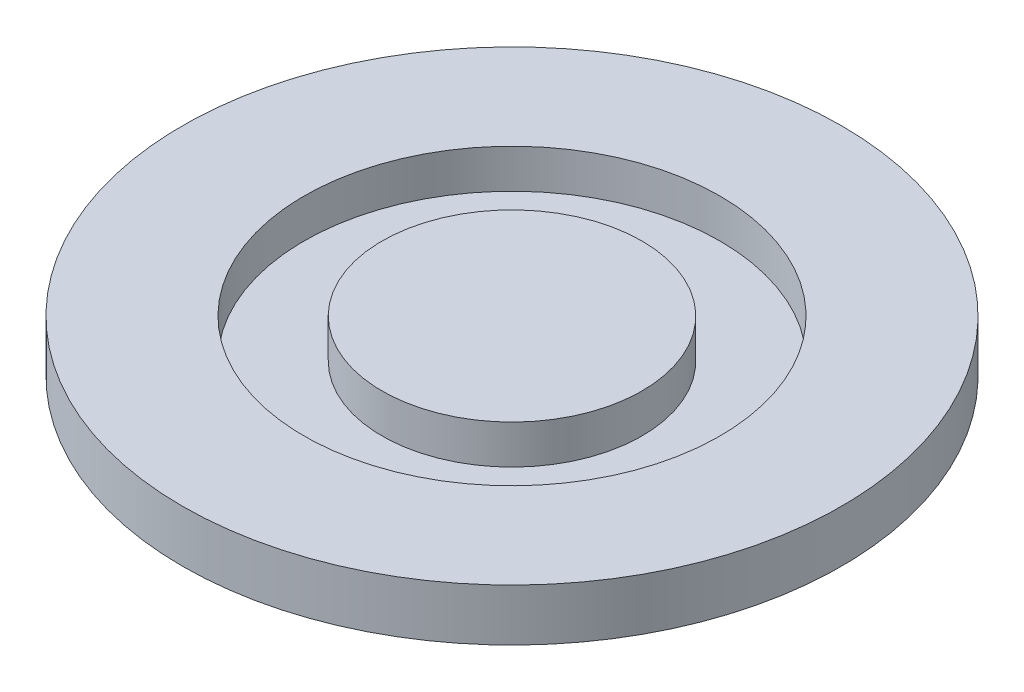
ISO-10303-21;
HEADER;
FILE_DESCRIPTION(('STEP AP214'),'2;1');
FILE_NAME('part.step','',(''),(''),'','','');
FILE_SCHEMA(('AUTOMOTIVE_DESIGN { 1 0 10303 214 1 1 1 1 }'));
ENDSEC;
DATA;
#1=APPLICATION_CONTEXT('core data for automotive mechanical design processes');
#2=APPLICATION_PROTOCOL_DEFINITION('international standard','automotive_design',2000,#1);
#3=PRODUCT_CONTEXT('',#1,'mechanical');
#4=PRODUCT('Part','Part','',(#3));
#5=PRODUCT_RELATED_PRODUCT_CATEGORY('part','',(#4));
#6=PRODUCT_DEFINITION_FORMATION('','',#4);
#7=PRODUCT_DEFINITION_CONTEXT('part definition',#1,'design');
#8=PRODUCT_DEFINITION('design','',#6,#7);
#9=PRODUCT_DEFINITION_SHAPE('','',#8);
#10=(LENGTH_UNIT() NAMED_UNIT(*) SI_UNIT(.MILLI.,.METRE.));
#11=(NAMED_UNIT(*) PLANE_ANGLE_UNIT() SI_UNIT($,.RADIAN.));
#12=(NAMED_UNIT(*) SI_UNIT($,.STERADIAN.) SOLID_ANGLE_UNIT());
#13=UNCERTAINTY_MEASURE_WITH_UNIT(LENGTH_MEASURE(1.E-05),#10,'distance_accuracy_value','');
#14=(GEOMETRIC_REPRESENTATION_CONTEXT(3) GLOBAL_UNCERTAINTY_ASSIGNED_CONTEXT((#13)) GLOBAL_UNIT_ASSIGNED_CONTEXT((#10,
#11,#12)) REPRESENTATION_CONTEXT('',''));
#15=CARTESIAN_POINT('',(0.,0.,0.));
#16=DIRECTION('',(0.,0.,1.));
#17=DIRECTION('',(1.,0.,0.));
#18=AXIS2_PLACEMENT_3D('',#15,#16,#17);
#19=CARTESIAN_POINT('',(80.5120023172982,0.,0.));
#20=DIRECTION('',(0.,-1.,0.));
#21=DIRECTION('',(0.,0.,-1.));
#22=AXIS2_PLACEMENT_3D('',#19,#20,#21);
#23=PLANE('',#22);
#24=CARTESIAN_POINT('',(0.,0.,0.));
#25=DIRECTION('',(0.,-1.,0.));
#26=DIRECTION('',(0.,0.,-1.));
#27=AXIS2_PLACEMENT_3D('',#24,#25,#26);
#28=CIRCLE('',#27,80.5120023172982);
#29=CARTESIAN_POINT('',(0.,0.,-80.5120023172982));
#30=VERTEX_POINT('',#29);
#31=EDGE_CURVE('E52',#30,#30,#28,.T.);
#32=ORIENTED_EDGE('',*,*,#31,.T.);
#33=EDGE_LOOP('',(#32));
#34=FACE_BOUND('',#33,.T.);
#35=ADVANCED_FACE('F30',(#34),#23,.T.);
#36=CARTESIAN_POINT('',(0.,12.7,0.));
#37=DIRECTION('',(0.,1.,0.));
#38=DIRECTION('',(0.,0.,1.));
#39=AXIS2_PLACEMENT_3D('',#36,#37,#38);
#40=PLANE('',#39);
#41=CARTESIAN_POINT('',(0.,12.7,0.));
#42=DIRECTION('',(0.,-1.,0.));
#43=DIRECTION('',(0.,0.,-1.));
#44=AXIS2_PLACEMENT_3D('',#41,#42,#43);
#45=CIRCLE('',#44,31.75);
#46=CARTESIAN_POINT('',(0.,12.7,-31.75));
#47=VERTEX_POINT('',#46);
#48=EDGE_CURVE('E10',#47,#47,#45,.T.);
#49=ORIENTED_EDGE('',*,*,#48,.F.);
#50=EDGE_LOOP('',(#49));
#51=FACE_BOUND('',#50,.T.);
#52=ADVANCED_FACE('F69',(#51),#40,.T.);
#53=CARTESIAN_POINT('',(0.,0.,0.));
#54=DIRECTION('',(0.,-1.,0.));
#55=DIRECTION('',(0.,0.,-1.));
#56=AXIS2_PLACEMENT_3D('',#53,#54,#55);
#57=CYLINDRICAL_SURFACE('',#56,31.75);
#58=ORIENTED_EDGE('',*,*,#48,.T.);
#59=EDGE_LOOP('',(#58));
#60=FACE_BOUND('',#59,.T.);
#61=CARTESIAN_POINT('',(0.,3.17499999999999,0.));
#62=DIRECTION('',(0.,-1.,0.));
#63=DIRECTION('',(0.,0.,-1.));
#64=AXIS2_PLACEMENT_3D('',#61,#62,#63);
#65=CIRCLE('',#64,31.75);
#66=CARTESIAN_POINT('',(0.,3.17499999999999,-31.75));
#67=VERTEX_POINT('',#66);
#68=EDGE_CURVE('E36',#67,#67,#65,.T.);
#69=ORIENTED_EDGE('',*,*,#68,.F.);
#70=EDGE_LOOP('',(#69));
#71=FACE_BOUND('',#70,.T.);
#72=ADVANCED_FACE('F73',(#60,#71),#57,.T.);
#73=CARTESIAN_POINT('',(31.75,3.17499999999999,0.));
#74=DIRECTION('',(0.,1.,0.));
#75=DIRECTION('',(0.,0.,1.));
#76=AXIS2_PLACEMENT_3D('',#73,#74,#75);
#77=PLANE('',#76);
#78=ORIENTED_EDGE('',*,*,#68,.T.);
#79=EDGE_LOOP('',(#78));
#80=FACE_BOUND('',#79,.T.);
#81=CARTESIAN_POINT('',(0.,3.17499999999999,0.));
#82=DIRECTION('',(0.,-1.,0.));
#83=DIRECTION('',(0.,0.,-1.));
#84=AXIS2_PLACEMENT_3D('',#81,#82,#83);
#85=CIRCLE('',#84,50.8);
#86=CARTESIAN_POINT('',(0.,3.17499999999999,-50.8));
#87=VERTEX_POINT('',#86);
#88=EDGE_CURVE('E40',#87,#87,#85,.T.);
#89=ORIENTED_EDGE('',*,*,#88,.F.);
#90=EDGE_LOOP('',(#89));
#91=FACE_BOUND('',#90,.T.);
#92=ADVANCED_FACE('F78',(#80,#91),#77,.T.);
#93=CARTESIAN_POINT('',(0.,0.,0.));
#94=DIRECTION('',(0.,-1.,0.));
#95=DIRECTION('',(0.,0.,-1.));
#96=AXIS2_PLACEMENT_3D('',#93,#94,#95);
#97=CYLINDRICAL_SURFACE('',#96,50.8);
#98=ORIENTED_EDGE('',*,*,#88,.T.);
#99=EDGE_LOOP('',(#98));
#100=FACE_BOUND('',#99,.T.);
#101=CARTESIAN_POINT('',(0.,12.7,0.));
#102=DIRECTION('',(0.,-1.,0.));
#103=DIRECTION('',(0.,0.,-1.));
#104=AXIS2_PLACEMENT_3D('',#101,#102,#103);
#105=CIRCLE('',#104,50.8);
#106=CARTESIAN_POINT('',(0.,12.7,-50.8));
#107=VERTEX_POINT('',#106);
#108=EDGE_CURVE('E44',#107,#107,#105,.T.);
#109=ORIENTED_EDGE('',*,*,#108,.F.);
#110=EDGE_LOOP('',(#109));
#111=FACE_BOUND('',#110,.T.);
#112=ADVANCED_FACE('F65',(#100,#111),#97,.F.);
#113=CARTESIAN_POINT('',(50.8,12.7,0.));
#114=DIRECTION('',(0.,1.,0.));
#115=DIRECTION('',(0.,0.,1.));
#116=AXIS2_PLACEMENT_3D('',#113,#114,#115);
#117=PLANE('',#116);
#118=ORIENTED_EDGE('',*,*,#108,.T.);
#119=EDGE_LOOP('',(#118));
#120=FACE_BOUND('',#119,.T.);
#121=CARTESIAN_POINT('',(0.,12.7,0.));
#122=DIRECTION('',(0.,-1.,0.));
#123=DIRECTION('',(0.,0.,-1.));
#124=AXIS2_PLACEMENT_3D('',#121,#122,#123);
#125=CIRCLE('',#124,80.5120023172982);
#126=CARTESIAN_POINT('',(0.,12.7,-80.5120023172982));
#127=VERTEX_POINT('',#126);
#128=EDGE_CURVE('E49',#127,#127,#125,.T.);
#129=ORIENTED_EDGE('',*,*,#128,.F.);
#130=EDGE_LOOP('',(#129));
#131=FACE_BOUND('',#130,.T.);
#132=ADVANCED_FACE('F59',(#120,#131),#117,.T.);
#133=CARTESIAN_POINT('',(0.,0.,0.));
#134=DIRECTION('',(0.,-1.,0.));
#135=DIRECTION('',(0.,0.,-1.));
#136=AXIS2_PLACEMENT_3D('',#133,#134,#135);
#137=CYLINDRICAL_SURFACE('',#136,80.5120023172982);
#138=ORIENTED_EDGE('',*,*,#128,.T.);
#139=EDGE_LOOP('',(#138));
#140=FACE_BOUND('',#139,.T.);
#141=ORIENTED_EDGE('',*,*,#31,.F.);
#142=EDGE_LOOP('',(#141));
#143=FACE_BOUND('',#142,.T.);
#144=ADVANCED_FACE('F57',(#140,#143),#137,.T.);
#145=CLOSED_SHELL('',(#35,#52,#72,#92,#112,#132,#144));
#146=MANIFOLD_SOLID_BREP('B2',#145);
#147=ADVANCED_BREP_SHAPE_REPRESENTATION('',(#18,#146),#14);
#148=SHAPE_DEFINITION_REPRESENTATION(#9,#147);
ENDSEC;
END-ISO-10303-21;
